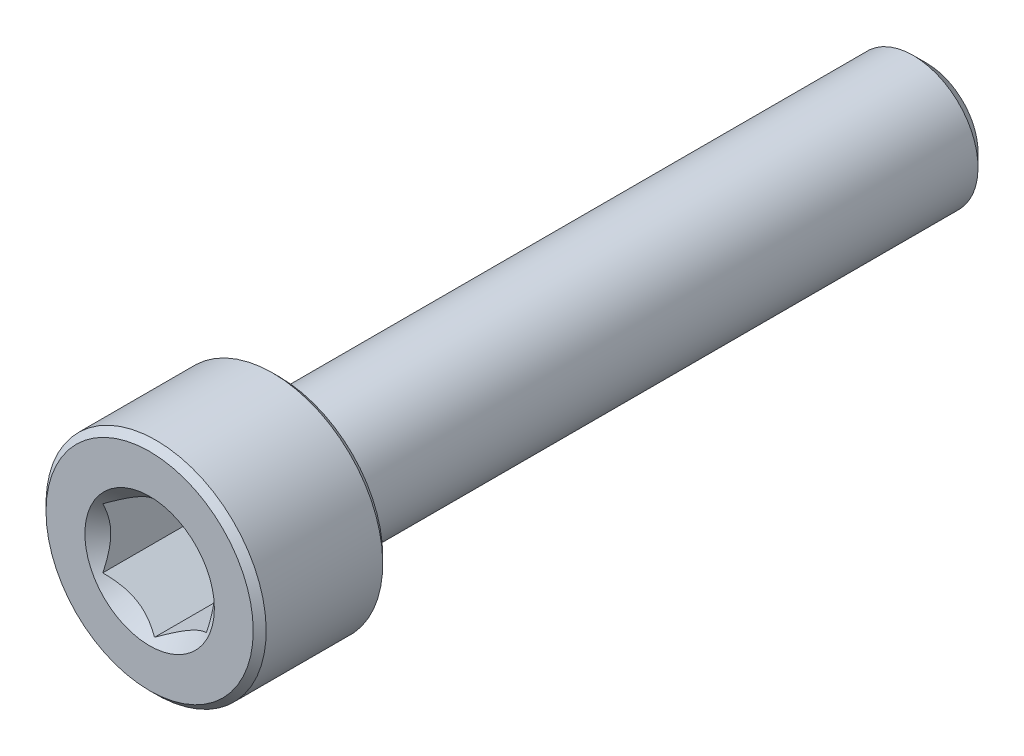
ISO-10303-21;
HEADER;
FILE_DESCRIPTION(('STEP AP214'),'2;1');
FILE_NAME('part.step','',(''),(''),'','','');
FILE_SCHEMA(('AUTOMOTIVE_DESIGN { 1 0 10303 214 1 1 1 1 }'));
ENDSEC;
DATA;
#1=APPLICATION_CONTEXT('core data for automotive mechanical design processes');
#2=APPLICATION_PROTOCOL_DEFINITION('international standard','automotive_design',2000,#1);
#3=PRODUCT_CONTEXT('',#1,'mechanical');
#4=PRODUCT('Part','Part','',(#3));
#5=PRODUCT_RELATED_PRODUCT_CATEGORY('part','',(#4));
#6=PRODUCT_DEFINITION_FORMATION('','',#4);
#7=PRODUCT_DEFINITION_CONTEXT('part definition',#1,'design');
#8=PRODUCT_DEFINITION('design','',#6,#7);
#9=PRODUCT_DEFINITION_SHAPE('','',#8);
#10=(LENGTH_UNIT() NAMED_UNIT(*) SI_UNIT(.MILLI.,.METRE.));
#11=(NAMED_UNIT(*) PLANE_ANGLE_UNIT() SI_UNIT($,.RADIAN.));
#12=(NAMED_UNIT(*) SI_UNIT($,.STERADIAN.) SOLID_ANGLE_UNIT());
#13=UNCERTAINTY_MEASURE_WITH_UNIT(LENGTH_MEASURE(1.E-05),#10,'distance_accuracy_value','');
#14=(GEOMETRIC_REPRESENTATION_CONTEXT(3) GLOBAL_UNCERTAINTY_ASSIGNED_CONTEXT((#13)) GLOBAL_UNIT_ASSIGNED_CONTEXT((#10,
#11,#12)) REPRESENTATION_CONTEXT('',''));
#15=CARTESIAN_POINT('',(0.,0.,0.));
#16=DIRECTION('',(0.,0.,1.));
#17=DIRECTION('',(1.,0.,0.));
#18=AXIS2_PLACEMENT_3D('',#15,#16,#17);
#19=CARTESIAN_POINT('',(0.,1.98038475772934,-15.));
#20=DIRECTION('',(0.,0.,-1.));
#21=DIRECTION('',(0.,1.,0.));
#22=AXIS2_PLACEMENT_3D('',#19,#20,#21);
#23=PLANE('',#22);
#24=CARTESIAN_POINT('',(0.,0.,-15.));
#25=DIRECTION('',(0.,0.,-1.));
#26=DIRECTION('',(0.,1.,0.));
#27=AXIS2_PLACEMENT_3D('',#24,#25,#26);
#28=CIRCLE('',#27,1.98038475772934);
#29=CARTESIAN_POINT('',(0.,1.98038475772934,-15.));
#30=VERTEX_POINT('',#29);
#31=EDGE_CURVE('E54',#30,#30,#28,.T.);
#32=ORIENTED_EDGE('',*,*,#31,.T.);
#33=EDGE_LOOP('',(#32));
#34=FACE_BOUND('',#33,.T.);
#35=ADVANCED_FACE('F41',(#34),#23,.T.);
#36=CARTESIAN_POINT('',(0.,0.,-15.));
#37=DIRECTION('',(0.,0.,1.));
#38=DIRECTION('',(0.,-1.,0.));
#39=AXIS2_PLACEMENT_3D('',#36,#37,#38);
#40=CONICAL_SURFACE('',#39,1.98038475772934,0.785398163397443);
#41=CARTESIAN_POINT('',(0.,0.,-14.4803847577293));
#42=DIRECTION('',(0.,0.,-1.));
#43=DIRECTION('',(0.,1.,0.));
#44=AXIS2_PLACEMENT_3D('',#41,#42,#43);
#45=CIRCLE('',#44,2.5);
#46=CARTESIAN_POINT('',(0.,2.5,-14.4803847577293));
#47=VERTEX_POINT('',#46);
#48=EDGE_CURVE('E157',#47,#47,#45,.T.);
#49=ORIENTED_EDGE('',*,*,#48,.T.);
#50=EDGE_LOOP('',(#49));
#51=FACE_BOUND('',#50,.T.);
#52=ORIENTED_EDGE('',*,*,#31,.F.);
#53=EDGE_LOOP('',(#52));
#54=FACE_BOUND('',#53,.T.);
#55=ADVANCED_FACE('F163',(#51,#54),#40,.T.);
#56=CARTESIAN_POINT('',(0.,0.,-15.));
#57=DIRECTION('',(0.,0.,-1.));
#58=DIRECTION('',(0.,1.,0.));
#59=AXIS2_PLACEMENT_3D('',#56,#57,#58);
#60=CYLINDRICAL_SURFACE('',#59,2.5);
#61=CARTESIAN_POINT('',(0.,0.,9.75));
#62=DIRECTION('',(0.,0.,-1.));
#63=DIRECTION('',(0.,1.,0.));
#64=AXIS2_PLACEMENT_3D('',#61,#62,#63);
#65=CIRCLE('',#64,2.5);
#66=CARTESIAN_POINT('',(0.,2.5,9.75));
#67=VERTEX_POINT('',#66);
#68=EDGE_CURVE('E154',#67,#67,#65,.T.);
#69=ORIENTED_EDGE('',*,*,#68,.T.);
#70=EDGE_LOOP('',(#69));
#71=FACE_BOUND('',#70,.T.);
#72=ORIENTED_EDGE('',*,*,#48,.F.);
#73=EDGE_LOOP('',(#72));
#74=FACE_BOUND('',#73,.T.);
#75=ADVANCED_FACE('F165',(#71,#74),#60,.T.);
#76=CARTESIAN_POINT('',(0.,0.,9.75));
#77=DIRECTION('',(0.,0.,-1.));
#78=DIRECTION('',(0.,1.,0.));
#79=AXIS2_PLACEMENT_3D('',#76,#77,#78);
#80=TOROIDAL_SURFACE('',#79,2.75,0.249999999999999);
#81=CARTESIAN_POINT('',(0.,0.,10.));
#82=DIRECTION('',(0.,0.,-1.));
#83=DIRECTION('',(0.,1.,0.));
#84=AXIS2_PLACEMENT_3D('',#81,#82,#83);
#85=CIRCLE('',#84,2.75);
#86=CARTESIAN_POINT('',(0.,2.75,10.));
#87=VERTEX_POINT('',#86);
#88=EDGE_CURVE('E151',#87,#87,#85,.T.);
#89=ORIENTED_EDGE('',*,*,#88,.T.);
#90=EDGE_LOOP('',(#89));
#91=FACE_BOUND('',#90,.T.);
#92=ORIENTED_EDGE('',*,*,#68,.F.);
#93=EDGE_LOOP('',(#92));
#94=FACE_BOUND('',#93,.T.);
#95=ADVANCED_FACE('F171',(#91,#94),#80,.F.);
#96=CARTESIAN_POINT('',(0.,4.,10.));
#97=DIRECTION('',(0.,0.,-1.));
#98=DIRECTION('',(0.,1.,0.));
#99=AXIS2_PLACEMENT_3D('',#96,#97,#98);
#100=PLANE('',#99);
#101=CARTESIAN_POINT('',(0.,0.,10.));
#102=DIRECTION('',(0.,0.,-1.));
#103=DIRECTION('',(0.,1.,0.));
#104=AXIS2_PLACEMENT_3D('',#101,#102,#103);
#105=CIRCLE('',#104,4.);
#106=CARTESIAN_POINT('',(0.,4.,10.));
#107=VERTEX_POINT('',#106);
#108=EDGE_CURVE('E148',#107,#107,#105,.T.);
#109=ORIENTED_EDGE('',*,*,#108,.T.);
#110=EDGE_LOOP('',(#109));
#111=FACE_BOUND('',#110,.T.);
#112=ORIENTED_EDGE('',*,*,#88,.F.);
#113=EDGE_LOOP('',(#112));
#114=FACE_BOUND('',#113,.T.);
#115=ADVANCED_FACE('F177',(#111,#114),#100,.T.);
#116=CARTESIAN_POINT('',(0.,0.,10.));
#117=DIRECTION('',(0.,0.,1.));
#118=DIRECTION('',(0.,-1.,0.));
#119=AXIS2_PLACEMENT_3D('',#116,#117,#118);
#120=CONICAL_SURFACE('',#119,4.,0.785398163397448);
#121=CARTESIAN_POINT('',(0.,0.,10.25));
#122=DIRECTION('',(0.,0.,-1.));
#123=DIRECTION('',(0.,1.,0.));
#124=AXIS2_PLACEMENT_3D('',#121,#122,#123);
#125=CIRCLE('',#124,4.25);
#126=CARTESIAN_POINT('',(0.,4.25,10.25));
#127=VERTEX_POINT('',#126);
#128=EDGE_CURVE('E145',#127,#127,#125,.T.);
#129=ORIENTED_EDGE('',*,*,#128,.T.);
#130=EDGE_LOOP('',(#129));
#131=FACE_BOUND('',#130,.T.);
#132=ORIENTED_EDGE('',*,*,#108,.F.);
#133=EDGE_LOOP('',(#132));
#134=FACE_BOUND('',#133,.T.);
#135=ADVANCED_FACE('F181',(#131,#134),#120,.T.);
#136=CARTESIAN_POINT('',(0.,0.,-15.));
#137=DIRECTION('',(0.,0.,-1.));
#138=DIRECTION('',(0.,1.,0.));
#139=AXIS2_PLACEMENT_3D('',#136,#137,#138);
#140=CYLINDRICAL_SURFACE('',#139,4.25);
#141=CARTESIAN_POINT('',(0.,0.,14.75));
#142=DIRECTION('',(0.,0.,-1.));
#143=DIRECTION('',(0.,1.,0.));
#144=AXIS2_PLACEMENT_3D('',#141,#142,#143);
#145=CIRCLE('',#144,4.25);
#146=CARTESIAN_POINT('',(0.,4.25,14.75));
#147=VERTEX_POINT('',#146);
#148=EDGE_CURVE('E142',#147,#147,#145,.T.);
#149=ORIENTED_EDGE('',*,*,#148,.T.);
#150=EDGE_LOOP('',(#149));
#151=FACE_BOUND('',#150,.T.);
#152=ORIENTED_EDGE('',*,*,#128,.F.);
#153=EDGE_LOOP('',(#152));
#154=FACE_BOUND('',#153,.T.);
#155=ADVANCED_FACE('F185',(#151,#154),#140,.T.);
#156=CARTESIAN_POINT('',(0.,0.,14.75));
#157=DIRECTION('',(0.,0.,-1.));
#158=DIRECTION('',(0.,1.,0.));
#159=AXIS2_PLACEMENT_3D('',#156,#157,#158);
#160=CONICAL_SURFACE('',#159,4.25,0.785398163397448);
#161=CARTESIAN_POINT('',(0.,0.,15.));
#162=DIRECTION('',(0.,0.,-1.));
#163=DIRECTION('',(0.,1.,0.));
#164=AXIS2_PLACEMENT_3D('',#161,#162,#163);
#165=CIRCLE('',#164,4.);
#166=CARTESIAN_POINT('',(0.,4.,15.));
#167=VERTEX_POINT('',#166);
#168=EDGE_CURVE('E139',#167,#167,#165,.T.);
#169=ORIENTED_EDGE('',*,*,#168,.T.);
#170=EDGE_LOOP('',(#169));
#171=FACE_BOUND('',#170,.T.);
#172=ORIENTED_EDGE('',*,*,#148,.F.);
#173=EDGE_LOOP('',(#172));
#174=FACE_BOUND('',#173,.T.);
#175=ADVANCED_FACE('F189',(#171,#174),#160,.T.);
#176=CARTESIAN_POINT('',(0.,0.,15.));
#177=DIRECTION('',(0.,0.,1.));
#178=DIRECTION('',(0.,-1.,0.));
#179=AXIS2_PLACEMENT_3D('',#176,#177,#178);
#180=PLANE('',#179);
#181=CARTESIAN_POINT('',(0.,0.,15.));
#182=DIRECTION('',(0.,0.,1.));
#183=DIRECTION('',(1.,0.,0.));
#184=AXIS2_PLACEMENT_3D('',#181,#182,#183);
#185=CIRCLE('',#184,2.5);
#186=CARTESIAN_POINT('',(2.5,0.,15.));
#187=VERTEX_POINT('',#186);
#188=EDGE_CURVE('E113',#187,#187,#185,.T.);
#189=ORIENTED_EDGE('',*,*,#188,.F.);
#190=EDGE_LOOP('',(#189));
#191=FACE_BOUND('',#190,.T.);
#192=ORIENTED_EDGE('',*,*,#168,.F.);
#193=EDGE_LOOP('',(#192));
#194=FACE_BOUND('',#193,.T.);
#195=ADVANCED_FACE('F193',(#191,#194),#180,.T.);
#196=CARTESIAN_POINT('',(0.,0.,15.));
#197=DIRECTION('',(0.,0.,1.));
#198=DIRECTION('',(1.,0.,0.));
#199=AXIS2_PLACEMENT_3D('',#196,#197,#198);
#200=CONICAL_SURFACE('',#199,2.5,0.78539816339745);
#201=ORIENTED_EDGE('',*,*,#188,.T.);
#202=EDGE_LOOP('',(#201));
#203=FACE_BOUND('',#202,.T.);
#204=CARTESIAN_POINT('',(-0.000200000000000702,-2.30951654681234,14.8095165554722));
#205=CARTESIAN_POINT('',(0.0685530340307049,-2.26982196410711,14.7698541669841));
#206=CARTESIAN_POINT('',(0.138455742135511,-2.22946361676572,14.7325210590427));
#207=CARTESIAN_POINT('',(0.280995244550436,-2.1471683966763,14.6641647618946));
#208=CARTESIAN_POINT('',(0.353645597565358,-2.10522369580642,14.6331796104957));
#209=CARTESIAN_POINT('',(0.500141601053971,-2.02064418875706,14.5801012933026));
#210=CARTESIAN_POINT('',(0.573949935246294,-1.97803092714269,14.5578747039351));
#211=CARTESIAN_POINT('',(0.723191631835265,-1.89186619344273,14.5236298934336));
#212=CARTESIAN_POINT('',(0.798620433918153,-1.84831735425552,14.5115861059026));
#213=CARTESIAN_POINT('',(0.92861550067108,-1.7732646674724,14.5007195886641));
#214=CARTESIAN_POINT('',(0.98301378397011,-1.74185780396625,14.4991108303685));
#215=CARTESIAN_POINT('',(1.09172145551969,-1.67909540053412,14.5018199543572));
#216=CARTESIAN_POINT('',(1.14603080592134,-1.64773988246021,14.5061399145165));
#217=CARTESIAN_POINT('',(1.25413672758934,-1.5853248994842,14.5204606441684));
#218=CARTESIAN_POINT('',(1.30793265655479,-1.55426580541469,14.5304677695205));
#219=CARTESIAN_POINT('',(1.41459426230557,-1.49268469862228,14.5556135070082));
#220=CARTESIAN_POINT('',(1.46746001007071,-1.46216264491917,14.5707517258007));
#221=CARTESIAN_POINT('',(1.60287973308985,-1.38397803138049,14.6156955801877));
#222=CARTESIAN_POINT('',(1.68459383484948,-1.33680037273297,14.6488899161843));
#223=CARTESIAN_POINT('',(1.8047470372578,-1.26742988897853,14.7049268999299));
#224=CARTESIAN_POINT('',(1.84434285210918,-1.24456923461531,14.7246157797054));
#225=CARTESIAN_POINT('',(1.92280095888787,-1.19927142554652,14.7657883951234));
#226=CARTESIAN_POINT('',(1.96166368359374,-1.17683402097614,14.7872710284098));
#227=CARTESIAN_POINT('',(2.0002,-1.15458506832541,14.8095165554722));
#228=B_SPLINE_CURVE_WITH_KNOTS('',3,(#204,#205,#206,#207,#208,#209,#210,#211,#212,#213,#214,
#215,#216,#217,#218,#219,#220,#221,#222,#223,#224,#225,#226,#227),.UNSPECIFIED.,.F.,.F.,(4,2,2,
2,2,2,2,2,2,2,2,4),(0.,0.266420613771065,0.534393751523389,0.798110374376915,1.06116288956937,
1.24939906803722,1.43770123566248,1.62621426093932,1.81471283831914,2.11415604834145,
2.26347170717791,2.41269626969771),.UNSPECIFIED.);
#229=CARTESIAN_POINT('',(0.,-2.3094010767585,14.8094010767585));
#230=VERTEX_POINT('',#229);
#231=CARTESIAN_POINT('',(2.,-1.15470053837925,14.8094010767585));
#232=VERTEX_POINT('',#231);
#233=EDGE_CURVE('E12',#230,#232,#228,.T.);
#234=ORIENTED_EDGE('',*,*,#233,.F.);
#235=CARTESIAN_POINT('',(-2.0002,-1.15458506832541,14.8095165554722));
#236=CARTESIAN_POINT('',(-1.9314469659693,-1.19427965103065,14.7698541669841));
#237=CARTESIAN_POINT('',(-1.86154425786449,-1.23463799837204,14.7325210590427));
#238=CARTESIAN_POINT('',(-1.71900475544956,-1.31693321846145,14.6641647618946));
#239=CARTESIAN_POINT('',(-1.64635440243464,-1.35887791933134,14.6331796104957));
#240=CARTESIAN_POINT('',(-1.49985839894603,-1.44345742638069,14.5801012933026));
#241=CARTESIAN_POINT('',(-1.42605006475371,-1.48607068799507,14.5578747039351));
#242=CARTESIAN_POINT('',(-1.27680836816474,-1.57223542169503,14.5236298934336));
#243=CARTESIAN_POINT('',(-1.20137956608185,-1.61578426088223,14.5115861059026));
#244=CARTESIAN_POINT('',(-1.07138449932892,-1.69083694766536,14.5007195886641));
#245=CARTESIAN_POINT('',(-1.01698621602989,-1.72224381117151,14.4991108303685));
#246=CARTESIAN_POINT('',(-0.908278544480305,-1.78500621460364,14.5018199543572));
#247=CARTESIAN_POINT('',(-0.853969194078659,-1.81636173267754,14.5061399145165));
#248=CARTESIAN_POINT('',(-0.74586327241066,-1.87877671565355,14.5204606441684));
#249=CARTESIAN_POINT('',(-0.692067343445206,-1.90983580972306,14.5304677695205));
#250=CARTESIAN_POINT('',(-0.585405737694425,-1.97141691651548,14.5556135070082));
#251=CARTESIAN_POINT('',(-0.532539989929286,-2.00193897021859,14.5707517258007));
#252=CARTESIAN_POINT('',(-0.397120266910154,-2.08012358375727,14.6156955801877));
#253=CARTESIAN_POINT('',(-0.315406165150521,-2.12730124240478,14.6488899161843));
#254=CARTESIAN_POINT('',(-0.195252962742197,-2.19667172615922,14.7049268999299));
#255=CARTESIAN_POINT('',(-0.155657147890822,-2.21953238052245,14.7246157797054));
#256=CARTESIAN_POINT('',(-0.0771990411121271,-2.26483018959124,14.7657883951234));
#257=CARTESIAN_POINT('',(-0.0383363164062592,-2.28726759416161,14.7872710284098));
#258=CARTESIAN_POINT('',(0.000199999999999988,-2.30951654681234,14.8095165554722));
#259=B_SPLINE_CURVE_WITH_KNOTS('',3,(#235,#236,#237,#238,#239,#240,#241,#242,#243,#244,#245,
#246,#247,#248,#249,#250,#251,#252,#253,#254,#255,#256,#257,#258),.UNSPECIFIED.,.F.,.F.,(4,2,2,
2,2,2,2,2,2,2,2,4),(0.,0.266420613771063,0.534393751523389,0.798110374376915,1.06116288956937,
1.24939906803722,1.43770123566248,1.62621426093932,1.81471283831913,2.11415604834145,
2.26347170717791,2.41269626969771),.UNSPECIFIED.);
#260=CARTESIAN_POINT('',(-2.,-1.15470053837925,14.8094010767585));
#261=VERTEX_POINT('',#260);
#262=EDGE_CURVE('E99',#261,#230,#259,.T.);
#263=ORIENTED_EDGE('',*,*,#262,.F.);
#264=CARTESIAN_POINT('',(-2.,-2.4363282173735,15.6520937775977));
#265=CARTESIAN_POINT('',(-2.,-2.37756861539498,15.6066872465053));
#266=CARTESIAN_POINT('',(-2.,-2.3184954434984,15.5616801779104));
#267=CARTESIAN_POINT('',(-2.,-2.19959272092663,15.4726483390254));
#268=CARTESIAN_POINT('',(-2.,-2.13976299708609,15.4286238002415));
#269=CARTESIAN_POINT('',(-2.,-2.01878107018385,15.3414272141699));
#270=CARTESIAN_POINT('',(-2.,-1.95762223024305,15.2982643454557));
#271=CARTESIAN_POINT('',(-2.,-1.8342919765469,15.2134153759447));
#272=CARTESIAN_POINT('',(-2.,-1.77212063255703,15.1717291740229));
#273=CARTESIAN_POINT('',(-2.,-1.64250425589681,15.0875153776362));
#274=CARTESIAN_POINT('',(-2.,-1.57497950569199,15.0451098648724));
#275=CARTESIAN_POINT('',(-2.,-1.43836292124304,14.9629069663128));
#276=CARTESIAN_POINT('',(-2.,-1.36927129198199,14.9231092419788));
#277=CARTESIAN_POINT('',(-2.,-1.22946591082451,14.8469468399184));
#278=CARTESIAN_POINT('',(-2.,-1.15875742447783,14.8105725722023));
#279=CARTESIAN_POINT('',(-2.,-1.01532512576936,14.7420788457068));
#280=CARTESIAN_POINT('',(-2.,-0.942602293254832,14.7099573606989));
#281=CARTESIAN_POINT('',(-2.,-0.802563929794697,14.6541640725453));
#282=CARTESIAN_POINT('',(-2.,-0.735461414893869,14.6299630266215));
#283=CARTESIAN_POINT('',(-2.,-0.59952410990542,14.5869299466273));
#284=CARTESIAN_POINT('',(-2.,-0.53068921170651,14.5680982485456));
#285=CARTESIAN_POINT('',(-2.,-0.392910896554117,14.5371465927004));
#286=CARTESIAN_POINT('',(-2.,-0.323995733612627,14.5249029950516));
#287=CARTESIAN_POINT('',(-2.,-0.185280158255946,14.5073869165155));
#288=CARTESIAN_POINT('',(-2.,-0.115479941304042,14.5021129225664));
#289=CARTESIAN_POINT('',(-2.,0.0210950908963897,14.498999231849));
#290=CARTESIAN_POINT('',(-2.,0.0878624606598995,14.5008309490091));
#291=CARTESIAN_POINT('',(-2.,0.220887683666247,14.5110671866824));
#292=CARTESIAN_POINT('',(-2.,0.287145490973665,14.5194722929118));
#293=CARTESIAN_POINT('',(-2.,0.419797323856618,14.5425181739193));
#294=CARTESIAN_POINT('',(-2.,0.486171732446488,14.5572700410496));
#295=CARTESIAN_POINT('',(-2.,0.61745034901901,14.5921855492781));
#296=CARTESIAN_POINT('',(-2.,0.682354630167636,14.6123489204093));
#297=CARTESIAN_POINT('',(-2.,0.8810512883903,14.6818144359667));
#298=CARTESIAN_POINT('',(-2.,1.01215270719302,14.7387852049274));
#299=CARTESIAN_POINT('',(-2.,1.26824882252757,14.8655856210837));
#300=CARTESIAN_POINT('',(-2.,1.39322009016298,14.9354603723917));
#301=CARTESIAN_POINT('',(-2.,1.57387821227227,15.0445973452281));
#302=CARTESIAN_POINT('',(-2.,1.63151917389051,15.0806891746732));
#303=CARTESIAN_POINT('',(-2.,1.7458111955852,15.1544192695576));
#304=CARTESIAN_POINT('',(-2.,1.80246218117122,15.1920576506589));
#305=CARTESIAN_POINT('',(-2.,1.91444855705535,15.2682926432714));
#306=CARTESIAN_POINT('',(-2.,1.96979085017648,15.3068791658611));
#307=CARTESIAN_POINT('',(-2.,2.07971570400232,15.3850891511631));
#308=CARTESIAN_POINT('',(-2.,2.13429846998238,15.4247123250238));
#309=CARTESIAN_POINT('',(-2.,2.18856258703246,15.4647607318902));
#310=B_SPLINE_CURVE_WITH_KNOTS('',3,(#264,#265,#266,#267,#268,#269,#270,#271,#272,#273,#274,
#275,#276,#277,#278,#279,#280,#281,#282,#283,#284,#285,#286,#287,#288,#289,#290,#291,#292,#293,
#294,#295,#296,#297,#298,#299,#300,#301,#302,#303,#304,#305,#306,#307,#308,#309),.UNSPECIFIED.,
.F.,.F.,(4,2,2,2,2,2,2,2,2,2,2,2,2,2,2,2,2,2,2,2,2,2,4),(0.,0.22278191546888,0.44561578073504,
0.670166074470361,0.894700960734708,1.13386235782497,1.37299264567398,1.61143178132183,
1.84975690120377,2.06357312765351,2.27740273079078,2.48706545754576,2.69668266022535,
2.89672477758776,3.09678472155875,3.30049882437158,3.50420276627178,3.93179810334681,
4.36091734620187,4.5649223116267,4.76894256181451,4.97132879094583,5.1736592156136),.UNSPECIFIED.);
#311=CARTESIAN_POINT('',(-2.,1.15470053837925,14.8094010767585));
#312=VERTEX_POINT('',#311);
#313=EDGE_CURVE('E112',#312,#261,#310,.F.);
#314=ORIENTED_EDGE('',*,*,#313,.F.);
#315=CARTESIAN_POINT('',(0.000199999999999834,2.30951654681234,14.8095165554722));
#316=CARTESIAN_POINT('',(-0.0685530340307061,2.26982196410711,14.7698541669841));
#317=CARTESIAN_POINT('',(-0.138455742135512,2.22946361676572,14.7325210590427));
#318=CARTESIAN_POINT('',(-0.280995244550437,2.1471683966763,14.6641647618946));
#319=CARTESIAN_POINT('',(-0.353645597565359,2.10522369580642,14.6331796104957));
#320=CARTESIAN_POINT('',(-0.500141601053972,2.02064418875706,14.5801012933026));
#321=CARTESIAN_POINT('',(-0.573949935246295,1.97803092714269,14.5578747039351));
#322=CARTESIAN_POINT('',(-0.723191631835266,1.89186619344273,14.5236298934336));
#323=CARTESIAN_POINT('',(-0.798620433918154,1.84831735425552,14.5115861059026));
#324=CARTESIAN_POINT('',(-0.928615500671081,1.77326466747239,14.5007195886641));
#325=CARTESIAN_POINT('',(-0.983013783970111,1.74185780396625,14.4991108303685));
#326=CARTESIAN_POINT('',(-1.0917214555197,1.67909540053412,14.5018199543572));
#327=CARTESIAN_POINT('',(-1.14603080592134,1.64773988246021,14.5061399145165));
#328=CARTESIAN_POINT('',(-1.25413672758934,1.5853248994842,14.5204606441684));
#329=CARTESIAN_POINT('',(-1.30793265655479,1.55426580541469,14.5304677695205));
#330=CARTESIAN_POINT('',(-1.41459426230558,1.49268469862228,14.5556135070082));
#331=CARTESIAN_POINT('',(-1.46746001007071,1.46216264491916,14.5707517258007));
#332=CARTESIAN_POINT('',(-1.60287973308985,1.38397803138048,14.6156955801877));
#333=CARTESIAN_POINT('',(-1.68459383484948,1.33680037273297,14.6488899161843));
#334=CARTESIAN_POINT('',(-1.8047470372578,1.26742988897853,14.7049268999299));
#335=CARTESIAN_POINT('',(-1.84434285210918,1.24456923461531,14.7246157797054));
#336=CARTESIAN_POINT('',(-1.92280095888787,1.19927142554652,14.7657883951234));
#337=CARTESIAN_POINT('',(-1.96166368359374,1.17683402097614,14.7872710284098));
#338=CARTESIAN_POINT('',(-2.0002,1.15458506832541,14.8095165554722));
#339=B_SPLINE_CURVE_WITH_KNOTS('',3,(#315,#316,#317,#318,#319,#320,#321,#322,#323,#324,#325,
#326,#327,#328,#329,#330,#331,#332,#333,#334,#335,#336,#337,#338),.UNSPECIFIED.,.F.,.F.,(4,2,2,
2,2,2,2,2,2,2,2,4),(0.,0.266420613771064,0.534393751523389,0.798110374376915,1.06116288956937,
1.24939906803722,1.43770123566248,1.62621426093932,1.81471283831913,2.11415604834145,
2.2634717071779,2.41269626969771),.UNSPECIFIED.);
#340=CARTESIAN_POINT('',(0.,2.3094010767585,14.8094010767585));
#341=VERTEX_POINT('',#340);
#342=EDGE_CURVE('E243',#341,#312,#339,.T.);
#343=ORIENTED_EDGE('',*,*,#342,.F.);
#344=CARTESIAN_POINT('',(2.0002,1.15458506832541,14.8095165554722));
#345=CARTESIAN_POINT('',(1.93144696596929,1.19427965103064,14.7698541669841));
#346=CARTESIAN_POINT('',(1.86154425786449,1.23463799837204,14.7325210590427));
#347=CARTESIAN_POINT('',(1.71900475544956,1.31693321846145,14.6641647618946));
#348=CARTESIAN_POINT('',(1.64635440243464,1.35887791933134,14.6331796104957));
#349=CARTESIAN_POINT('',(1.49985839894603,1.44345742638069,14.5801012933026));
#350=CARTESIAN_POINT('',(1.42605006475371,1.48607068799507,14.5578747039351));
#351=CARTESIAN_POINT('',(1.27680836816473,1.57223542169503,14.5236298934336));
#352=CARTESIAN_POINT('',(1.20137956608185,1.61578426088223,14.5115861059026));
#353=CARTESIAN_POINT('',(1.07138449932892,1.69083694766536,14.5007195886641));
#354=CARTESIAN_POINT('',(1.01698621602989,1.72224381117151,14.4991108303685));
#355=CARTESIAN_POINT('',(0.908278544480305,1.78500621460364,14.5018199543572));
#356=CARTESIAN_POINT('',(0.853969194078659,1.81636173267754,14.5061399145165));
#357=CARTESIAN_POINT('',(0.74586327241066,1.87877671565355,14.5204606441684));
#358=CARTESIAN_POINT('',(0.692067343445206,1.90983580972306,14.5304677695205));
#359=CARTESIAN_POINT('',(0.585405737694425,1.97141691651548,14.5556135070082));
#360=CARTESIAN_POINT('',(0.532539989929286,2.00193897021859,14.5707517258007));
#361=CARTESIAN_POINT('',(0.397120266910154,2.08012358375727,14.6156955801877));
#362=CARTESIAN_POINT('',(0.315406165150521,2.12730124240478,14.6488899161843));
#363=CARTESIAN_POINT('',(0.195252962742197,2.19667172615922,14.7049268999299));
#364=CARTESIAN_POINT('',(0.155657147890823,2.21953238052245,14.7246157797054));
#365=CARTESIAN_POINT('',(0.0771990411121279,2.26483018959123,14.7657883951234));
#366=CARTESIAN_POINT('',(0.0383363164062599,2.28726759416161,14.7872710284097));
#367=CARTESIAN_POINT('',(-0.00019999999999957,2.30951654681234,14.8095165554722));
#368=B_SPLINE_CURVE_WITH_KNOTS('',3,(#344,#345,#346,#347,#348,#349,#350,#351,#352,#353,#354,
#355,#356,#357,#358,#359,#360,#361,#362,#363,#364,#365,#366,#367),.UNSPECIFIED.,.F.,.F.,(4,2,2,
2,2,2,2,2,2,2,2,4),(0.,0.266420613771065,0.534393751523389,0.798110374376916,1.06116288956937,
1.24939906803722,1.43770123566248,1.62621426093932,1.81471283831913,2.11415604834145,
2.2634717071779,2.41269626969771),.UNSPECIFIED.);
#369=CARTESIAN_POINT('',(2.,1.15470053837925,14.8094010767585));
#370=VERTEX_POINT('',#369);
#371=EDGE_CURVE('E216',#370,#341,#368,.T.);
#372=ORIENTED_EDGE('',*,*,#371,.F.);
#373=CARTESIAN_POINT('',(2.,-2.4363282173735,15.6520937775977));
#374=CARTESIAN_POINT('',(2.,-2.37756861539498,15.6066872465053));
#375=CARTESIAN_POINT('',(2.,-2.31849544349839,15.5616801779104));
#376=CARTESIAN_POINT('',(2.,-2.19959272092663,15.4726483390254));
#377=CARTESIAN_POINT('',(2.,-2.13976299708609,15.4286238002415));
#378=CARTESIAN_POINT('',(2.,-2.01878107018385,15.3414272141699));
#379=CARTESIAN_POINT('',(2.,-1.95762223024304,15.2982643454557));
#380=CARTESIAN_POINT('',(2.,-1.8342919765469,15.2134153759447));
#381=CARTESIAN_POINT('',(2.,-1.77212063255703,15.1717291740229));
#382=CARTESIAN_POINT('',(2.,-1.6425042558968,15.0875153776362));
#383=CARTESIAN_POINT('',(2.,-1.57497950569199,15.0451098648724));
#384=CARTESIAN_POINT('',(2.,-1.43836292124304,14.9629069663128));
#385=CARTESIAN_POINT('',(2.,-1.36927129198199,14.9231092419788));
#386=CARTESIAN_POINT('',(2.,-1.22946591082451,14.8469468399184));
#387=CARTESIAN_POINT('',(2.,-1.15875742447783,14.8105725722023));
#388=CARTESIAN_POINT('',(2.,-1.01532512576936,14.7420788457068));
#389=CARTESIAN_POINT('',(2.,-0.942602293254831,14.7099573606989));
#390=CARTESIAN_POINT('',(2.,-0.802563929794695,14.6541640725453));
#391=CARTESIAN_POINT('',(2.,-0.735461414893866,14.6299630266215));
#392=CARTESIAN_POINT('',(2.,-0.599524109905418,14.5869299466273));
#393=CARTESIAN_POINT('',(2.,-0.530689211706508,14.5680982485456));
#394=CARTESIAN_POINT('',(2.,-0.392910896554115,14.5371465927004));
#395=CARTESIAN_POINT('',(2.,-0.323995733612625,14.5249029950516));
#396=CARTESIAN_POINT('',(2.,-0.185280158255945,14.5073869165155));
#397=CARTESIAN_POINT('',(2.,-0.115479941304041,14.5021129225664));
#398=CARTESIAN_POINT('',(2.,0.0210950908963903,14.498999231849));
#399=CARTESIAN_POINT('',(2.,0.0878624606599001,14.5008309490091));
#400=CARTESIAN_POINT('',(2.,0.220887683666247,14.5110671866824));
#401=CARTESIAN_POINT('',(2.,0.287145490973666,14.5194722929118));
#402=CARTESIAN_POINT('',(2.,0.419797323856618,14.5425181739193));
#403=CARTESIAN_POINT('',(2.,0.486171732446489,14.5572700410496));
#404=CARTESIAN_POINT('',(2.,0.617450349019011,14.5921855492781));
#405=CARTESIAN_POINT('',(2.,0.682354630167637,14.6123489204093));
#406=CARTESIAN_POINT('',(2.,0.8810512883903,14.6818144359667));
#407=CARTESIAN_POINT('',(2.,1.01215270719302,14.7387852049274));
#408=CARTESIAN_POINT('',(2.,1.26824882252757,14.8655856210837));
#409=CARTESIAN_POINT('',(2.,1.39322009016298,14.9354603723918));
#410=CARTESIAN_POINT('',(2.,1.57387821227228,15.0445973452281));
#411=CARTESIAN_POINT('',(2.,1.63151917389051,15.0806891746732));
#412=CARTESIAN_POINT('',(2.,1.7458111955852,15.1544192695576));
#413=CARTESIAN_POINT('',(2.,1.80246218117122,15.1920576506589));
#414=CARTESIAN_POINT('',(2.,1.91444855705535,15.2682926432714));
#415=CARTESIAN_POINT('',(2.,1.96979085017648,15.3068791658611));
#416=CARTESIAN_POINT('',(2.,2.07971570400233,15.3850891511631));
#417=CARTESIAN_POINT('',(2.,2.13429846998238,15.4247123250238));
#418=CARTESIAN_POINT('',(2.,2.18856258703246,15.4647607318902));
#419=B_SPLINE_CURVE_WITH_KNOTS('',3,(#373,#374,#375,#376,#377,#378,#379,#380,#381,#382,#383,
#384,#385,#386,#387,#388,#389,#390,#391,#392,#393,#394,#395,#396,#397,#398,#399,#400,#401,#402,
#403,#404,#405,#406,#407,#408,#409,#410,#411,#412,#413,#414,#415,#416,#417,#418),.UNSPECIFIED.,
.F.,.F.,(4,2,2,2,2,2,2,2,2,2,2,2,2,2,2,2,2,2,2,2,2,2,4),(0.,0.222781915468881,0.44561578073504,
0.670166074470362,0.894700960734709,1.13386235782496,1.37299264567397,1.61143178132183,
1.84975690120377,2.06357312765351,2.27740273079077,2.48706545754576,2.69668266022535,
2.89672477758776,3.09678472155874,3.30049882437157,3.50420276627178,3.93179810334681,
4.36091734620187,4.5649223116267,4.76894256181451,4.97132879094583,5.1736592156136),.UNSPECIFIED.);
#420=EDGE_CURVE('E61',#232,#370,#419,.T.);
#421=ORIENTED_EDGE('',*,*,#420,.F.);
#422=EDGE_LOOP('',(#234,#263,#314,#343,#372,#421));
#423=FACE_BOUND('',#422,.T.);
#424=ADVANCED_FACE('F98',(#203,#423),#200,.F.);
#425=CARTESIAN_POINT('',(0.,4.,11.));
#426=DIRECTION('',(0.,0.,-1.));
#427=DIRECTION('',(0.,1.,0.));
#428=AXIS2_PLACEMENT_3D('',#425,#426,#427);
#429=PLANE('',#428);
#430=DIRECTION('',(0.866025403784439,0.5,0.));
#431=VECTOR('',#430,1.);
#432=CARTESIAN_POINT('',(0.,-2.3094010767585,11.));
#433=LINE('',#432,#431);
#434=CARTESIAN_POINT('',(0.,-2.3094010767585,11.));
#435=VERTEX_POINT('',#434);
#436=CARTESIAN_POINT('',(2.,-1.15470053837925,11.));
#437=VERTEX_POINT('',#436);
#438=EDGE_CURVE('E116',#435,#437,#433,.T.);
#439=ORIENTED_EDGE('',*,*,#438,.T.);
#440=DIRECTION('',(0.,1.,0.));
#441=VECTOR('',#440,1.);
#442=CARTESIAN_POINT('',(2.,-1.15470053837925,11.));
#443=LINE('',#442,#441);
#444=CARTESIAN_POINT('',(2.,1.15470053837925,11.));
#445=VERTEX_POINT('',#444);
#446=EDGE_CURVE('E68',#437,#445,#443,.T.);
#447=ORIENTED_EDGE('',*,*,#446,.T.);
#448=DIRECTION('',(-0.866025403784439,0.5,0.));
#449=VECTOR('',#448,1.);
#450=CARTESIAN_POINT('',(2.,1.15470053837925,11.));
#451=LINE('',#450,#449);
#452=CARTESIAN_POINT('',(0.,2.3094010767585,11.));
#453=VERTEX_POINT('',#452);
#454=EDGE_CURVE('E124',#445,#453,#451,.T.);
#455=ORIENTED_EDGE('',*,*,#454,.T.);
#456=DIRECTION('',(-0.866025403784439,-0.5,0.));
#457=VECTOR('',#456,1.);
#458=CARTESIAN_POINT('',(0.,2.3094010767585,11.));
#459=LINE('',#458,#457);
#460=CARTESIAN_POINT('',(-2.,1.15470053837925,11.));
#461=VERTEX_POINT('',#460);
#462=EDGE_CURVE('E131',#453,#461,#459,.T.);
#463=ORIENTED_EDGE('',*,*,#462,.T.);
#464=DIRECTION('',(0.,-1.,0.));
#465=VECTOR('',#464,1.);
#466=CARTESIAN_POINT('',(-2.,1.15470053837925,11.));
#467=LINE('',#466,#465);
#468=CARTESIAN_POINT('',(-2.,-1.15470053837925,11.));
#469=VERTEX_POINT('',#468);
#470=EDGE_CURVE('E127',#461,#469,#467,.T.);
#471=ORIENTED_EDGE('',*,*,#470,.T.);
#472=DIRECTION('',(0.866025403784439,-0.5,0.));
#473=VECTOR('',#472,1.);
#474=CARTESIAN_POINT('',(-2.,-1.15470053837925,11.));
#475=LINE('',#474,#473);
#476=EDGE_CURVE('E117',#469,#435,#475,.T.);
#477=ORIENTED_EDGE('',*,*,#476,.T.);
#478=EDGE_LOOP('',(#439,#447,#455,#463,#471,#477));
#479=FACE_BOUND('',#478,.T.);
#480=ADVANCED_FACE('F198',(#479),#429,.F.);
#481=CARTESIAN_POINT('',(0.,-2.3094010767585,3.88989907339221));
#482=DIRECTION('',(0.5,-0.866025403784439,0.));
#483=DIRECTION('',(0.866025403784439,0.5,0.));
#484=AXIS2_PLACEMENT_3D('',#481,#482,#483);
#485=PLANE('',#484);
#486=DIRECTION('',(0.,0.,1.));
#487=VECTOR('',#486,1.);
#488=CARTESIAN_POINT('',(0.,-2.3094010767585,3.88989907339221));
#489=LINE('',#488,#487);
#490=EDGE_CURVE('E108',#435,#230,#489,.T.);
#491=ORIENTED_EDGE('',*,*,#490,.T.);
#492=ORIENTED_EDGE('',*,*,#233,.T.);
#493=DIRECTION('',(0.,0.,1.));
#494=VECTOR('',#493,1.);
#495=CARTESIAN_POINT('',(2.,-1.15470053837925,3.88989907339221));
#496=LINE('',#495,#494);
#497=EDGE_CURVE('E119',#437,#232,#496,.T.);
#498=ORIENTED_EDGE('',*,*,#497,.F.);
#499=ORIENTED_EDGE('',*,*,#438,.F.);
#500=EDGE_LOOP('',(#491,#492,#498,#499));
#501=FACE_BOUND('',#500,.T.);
#502=ADVANCED_FACE('F115',(#501),#485,.F.);
#503=CARTESIAN_POINT('',(-2.,-1.15470053837925,3.88989907339221));
#504=DIRECTION('',(-0.5,-0.866025403784439,0.));
#505=DIRECTION('',(0.866025403784439,-0.5,0.));
#506=AXIS2_PLACEMENT_3D('',#503,#504,#505);
#507=PLANE('',#506);
#508=DIRECTION('',(0.,0.,1.));
#509=VECTOR('',#508,1.);
#510=CARTESIAN_POINT('',(-2.,-1.15470053837925,3.88989907339221));
#511=LINE('',#510,#509);
#512=EDGE_CURVE('E111',#469,#261,#511,.T.);
#513=ORIENTED_EDGE('',*,*,#512,.T.);
#514=ORIENTED_EDGE('',*,*,#262,.T.);
#515=ORIENTED_EDGE('',*,*,#490,.F.);
#516=ORIENTED_EDGE('',*,*,#476,.F.);
#517=EDGE_LOOP('',(#513,#514,#515,#516));
#518=FACE_BOUND('',#517,.T.);
#519=ADVANCED_FACE('F107',(#518),#507,.F.);
#520=CARTESIAN_POINT('',(-2.,1.15470053837925,3.88989907339221));
#521=DIRECTION('',(-1.,0.,0.));
#522=DIRECTION('',(0.,0.,1.));
#523=AXIS2_PLACEMENT_3D('',#520,#521,#522);
#524=PLANE('',#523);
#525=DIRECTION('',(0.,0.,1.));
#526=VECTOR('',#525,1.);
#527=CARTESIAN_POINT('',(-2.,1.15470053837925,3.88989907339221));
#528=LINE('',#527,#526);
#529=EDGE_CURVE('E128',#461,#312,#528,.T.);
#530=ORIENTED_EDGE('',*,*,#529,.T.);
#531=ORIENTED_EDGE('',*,*,#313,.T.);
#532=ORIENTED_EDGE('',*,*,#512,.F.);
#533=ORIENTED_EDGE('',*,*,#470,.F.);
#534=EDGE_LOOP('',(#530,#531,#532,#533));
#535=FACE_BOUND('',#534,.T.);
#536=ADVANCED_FACE('F252',(#535),#524,.F.);
#537=CARTESIAN_POINT('',(0.,2.3094010767585,3.88989907339221));
#538=DIRECTION('',(-0.5,0.866025403784439,0.));
#539=DIRECTION('',(-0.866025403784439,-0.5,0.));
#540=AXIS2_PLACEMENT_3D('',#537,#538,#539);
#541=PLANE('',#540);
#542=DIRECTION('',(0.,0.,1.));
#543=VECTOR('',#542,1.);
#544=CARTESIAN_POINT('',(0.,2.3094010767585,3.88989907339221));
#545=LINE('',#544,#543);
#546=EDGE_CURVE('E132',#453,#341,#545,.T.);
#547=ORIENTED_EDGE('',*,*,#546,.T.);
#548=ORIENTED_EDGE('',*,*,#342,.T.);
#549=ORIENTED_EDGE('',*,*,#529,.F.);
#550=ORIENTED_EDGE('',*,*,#462,.F.);
#551=EDGE_LOOP('',(#547,#548,#549,#550));
#552=FACE_BOUND('',#551,.T.);
#553=ADVANCED_FACE('F249',(#552),#541,.F.);
#554=CARTESIAN_POINT('',(2.,1.15470053837925,3.88989907339221));
#555=DIRECTION('',(0.5,0.866025403784439,0.));
#556=DIRECTION('',(-0.866025403784439,0.5,0.));
#557=AXIS2_PLACEMENT_3D('',#554,#555,#556);
#558=PLANE('',#557);
#559=DIRECTION('',(0.,0.,1.));
#560=VECTOR('',#559,1.);
#561=CARTESIAN_POINT('',(2.,1.15470053837925,3.88989907339221));
#562=LINE('',#561,#560);
#563=EDGE_CURVE('E135',#445,#370,#562,.T.);
#564=ORIENTED_EDGE('',*,*,#563,.T.);
#565=ORIENTED_EDGE('',*,*,#371,.T.);
#566=ORIENTED_EDGE('',*,*,#546,.F.);
#567=ORIENTED_EDGE('',*,*,#454,.F.);
#568=EDGE_LOOP('',(#564,#565,#566,#567));
#569=FACE_BOUND('',#568,.T.);
#570=ADVANCED_FACE('F206',(#569),#558,.F.);
#571=CARTESIAN_POINT('',(2.,-1.15470053837925,3.88989907339221));
#572=DIRECTION('',(1.,0.,0.));
#573=DIRECTION('',(0.,0.,-1.));
#574=AXIS2_PLACEMENT_3D('',#571,#572,#573);
#575=PLANE('',#574);
#576=ORIENTED_EDGE('',*,*,#497,.T.);
#577=ORIENTED_EDGE('',*,*,#420,.T.);
#578=ORIENTED_EDGE('',*,*,#563,.F.);
#579=ORIENTED_EDGE('',*,*,#446,.F.);
#580=EDGE_LOOP('',(#576,#577,#578,#579));
#581=FACE_BOUND('',#580,.T.);
#582=ADVANCED_FACE('F202',(#581),#575,.F.);
#583=CLOSED_SHELL('',(#35,#55,#75,#95,#115,#135,#155,#175,#195,#424,#480,#502,#519,#536,#553,
#570,#582));
#584=MANIFOLD_SOLID_BREP('B2',#583);
#585=ADVANCED_BREP_SHAPE_REPRESENTATION('',(#18,#584),#14);
#586=SHAPE_DEFINITION_REPRESENTATION(#9,#585);
ENDSEC;
END-ISO-10303-21;
